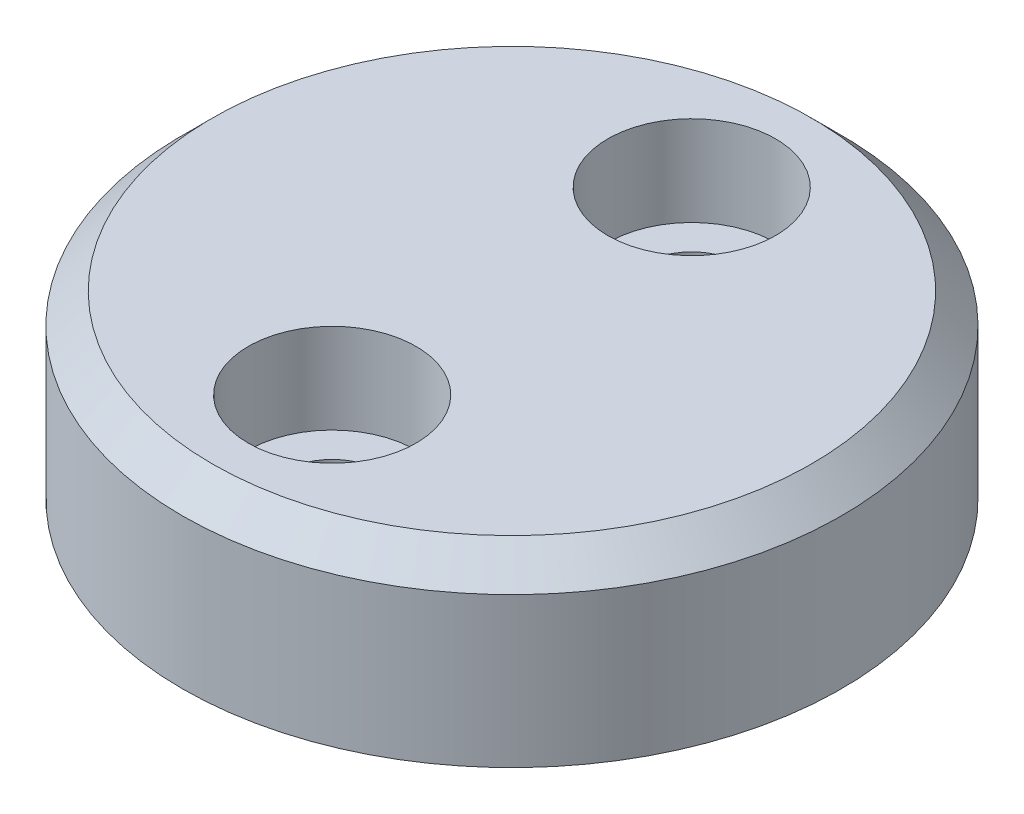
ISO-10303-21;
HEADER;
FILE_DESCRIPTION(('STEP AP214'),'2;1');
FILE_NAME('part.step','',(''),(''),'','','');
FILE_SCHEMA(('AUTOMOTIVE_DESIGN { 1 0 10303 214 1 1 1 1 }'));
ENDSEC;
DATA;
#1=APPLICATION_CONTEXT('core data for automotive mechanical design processes');
#2=APPLICATION_PROTOCOL_DEFINITION('international standard','automotive_design',2000,#1);
#3=PRODUCT_CONTEXT('',#1,'mechanical');
#4=PRODUCT('Part','Part','',(#3));
#5=PRODUCT_RELATED_PRODUCT_CATEGORY('part','',(#4));
#6=PRODUCT_DEFINITION_FORMATION('','',#4);
#7=PRODUCT_DEFINITION_CONTEXT('part definition',#1,'design');
#8=PRODUCT_DEFINITION('design','',#6,#7);
#9=PRODUCT_DEFINITION_SHAPE('','',#8);
#10=(LENGTH_UNIT() NAMED_UNIT(*) SI_UNIT(.MILLI.,.METRE.));
#11=(NAMED_UNIT(*) PLANE_ANGLE_UNIT() SI_UNIT($,.RADIAN.));
#12=(NAMED_UNIT(*) SI_UNIT($,.STERADIAN.) SOLID_ANGLE_UNIT());
#13=UNCERTAINTY_MEASURE_WITH_UNIT(LENGTH_MEASURE(1.E-05),#10,'distance_accuracy_value','');
#14=(GEOMETRIC_REPRESENTATION_CONTEXT(3) GLOBAL_UNCERTAINTY_ASSIGNED_CONTEXT((#13)) GLOBAL_UNIT_ASSIGNED_CONTEXT((#10,
#11,#12)) REPRESENTATION_CONTEXT('',''));
#15=CARTESIAN_POINT('',(0.,0.,0.));
#16=DIRECTION('',(0.,0.,1.));
#17=DIRECTION('',(1.,0.,0.));
#18=AXIS2_PLACEMENT_3D('',#15,#16,#17);
#19=CARTESIAN_POINT('',(0.,0.,6.));
#20=DIRECTION('',(0.,1.,0.));
#21=DIRECTION('',(0.,0.,1.));
#22=AXIS2_PLACEMENT_3D('',#19,#20,#21);
#23=CYLINDRICAL_SURFACE('',#22,1.6);
#24=CARTESIAN_POINT('',(0.,0.,6.));
#25=DIRECTION('',(0.,1.,0.));
#26=DIRECTION('',(0.,0.,1.));
#27=AXIS2_PLACEMENT_3D('',#24,#25,#26);
#28=CIRCLE('',#27,1.6);
#29=CARTESIAN_POINT('',(0.,0.,7.6));
#30=VERTEX_POINT('',#29);
#31=EDGE_CURVE('E65',#30,#30,#28,.T.);
#32=ORIENTED_EDGE('',*,*,#31,.F.);
#33=EDGE_LOOP('',(#32));
#34=FACE_BOUND('',#33,.T.);
#35=CARTESIAN_POINT('',(0.,3.5,6.));
#36=DIRECTION('',(0.,1.,0.));
#37=DIRECTION('',(0.,0.,1.));
#38=AXIS2_PLACEMENT_3D('',#35,#36,#37);
#39=CIRCLE('',#38,1.6);
#40=CARTESIAN_POINT('',(0.,3.5,7.6));
#41=VERTEX_POINT('',#40);
#42=EDGE_CURVE('E42',#41,#41,#39,.F.);
#43=ORIENTED_EDGE('',*,*,#42,.F.);
#44=EDGE_LOOP('',(#43));
#45=FACE_BOUND('',#44,.T.);
#46=ADVANCED_FACE('F39',(#34,#45),#23,.F.);
#47=CARTESIAN_POINT('',(0.,0.,-6.));
#48=DIRECTION('',(0.,1.,0.));
#49=DIRECTION('',(0.,0.,1.));
#50=AXIS2_PLACEMENT_3D('',#47,#48,#49);
#51=CYLINDRICAL_SURFACE('',#50,1.6);
#52=CARTESIAN_POINT('',(0.,0.,-6.));
#53=DIRECTION('',(0.,1.,0.));
#54=DIRECTION('',(0.,0.,1.));
#55=AXIS2_PLACEMENT_3D('',#52,#53,#54);
#56=CIRCLE('',#55,1.6);
#57=CARTESIAN_POINT('',(0.,0.,-4.4));
#58=VERTEX_POINT('',#57);
#59=EDGE_CURVE('E80',#58,#58,#56,.T.);
#60=ORIENTED_EDGE('',*,*,#59,.F.);
#61=EDGE_LOOP('',(#60));
#62=FACE_BOUND('',#61,.T.);
#63=CARTESIAN_POINT('',(0.,3.5,-6.));
#64=DIRECTION('',(0.,1.,0.));
#65=DIRECTION('',(0.,0.,1.));
#66=AXIS2_PLACEMENT_3D('',#63,#64,#65);
#67=CIRCLE('',#66,1.6);
#68=CARTESIAN_POINT('',(0.,3.5,-4.4));
#69=VERTEX_POINT('',#68);
#70=EDGE_CURVE('E57',#69,#69,#67,.F.);
#71=ORIENTED_EDGE('',*,*,#70,.F.);
#72=EDGE_LOOP('',(#71));
#73=FACE_BOUND('',#72,.T.);
#74=ADVANCED_FACE('F102',(#62,#73),#51,.F.);
#75=CARTESIAN_POINT('',(0.,0.5,0.));
#76=DIRECTION('',(0.,-1.,0.));
#77=DIRECTION('',(0.,0.,-1.));
#78=AXIS2_PLACEMENT_3D('',#75,#76,#77);
#79=CYLINDRICAL_SURFACE('',#78,10.);
#80=CARTESIAN_POINT('',(0.,0.5,0.));
#81=DIRECTION('',(0.,1.,0.));
#82=DIRECTION('',(0.,0.,1.));
#83=AXIS2_PLACEMENT_3D('',#80,#81,#82);
#84=CIRCLE('',#83,10.);
#85=CARTESIAN_POINT('',(0.,0.5,10.));
#86=VERTEX_POINT('',#85);
#87=EDGE_CURVE('E52',#86,#86,#84,.T.);
#88=ORIENTED_EDGE('',*,*,#87,.F.);
#89=EDGE_LOOP('',(#88));
#90=FACE_BOUND('',#89,.T.);
#91=CARTESIAN_POINT('',(0.,0.,0.));
#92=DIRECTION('',(0.,1.,0.));
#93=DIRECTION('',(0.,0.,1.));
#94=AXIS2_PLACEMENT_3D('',#91,#92,#93);
#95=CIRCLE('',#94,10.);
#96=CARTESIAN_POINT('',(0.,0.,10.));
#97=VERTEX_POINT('',#96);
#98=EDGE_CURVE('E83',#97,#97,#95,.T.);
#99=ORIENTED_EDGE('',*,*,#98,.T.);
#100=EDGE_LOOP('',(#99));
#101=FACE_BOUND('',#100,.T.);
#102=ADVANCED_FACE('F88',(#90,#101),#79,.T.);
#103=CARTESIAN_POINT('',(0.,0.,0.));
#104=DIRECTION('',(0.,1.,0.));
#105=DIRECTION('',(0.,0.,1.));
#106=AXIS2_PLACEMENT_3D('',#103,#104,#105);
#107=PLANE('',#106);
#108=ORIENTED_EDGE('',*,*,#59,.T.);
#109=EDGE_LOOP('',(#108));
#110=FACE_BOUND('',#109,.T.);
#111=ORIENTED_EDGE('',*,*,#31,.T.);
#112=EDGE_LOOP('',(#111));
#113=FACE_BOUND('',#112,.T.);
#114=ORIENTED_EDGE('',*,*,#98,.F.);
#115=EDGE_LOOP('',(#114));
#116=FACE_BOUND('',#115,.T.);
#117=ADVANCED_FACE('F91',(#110,#113,#116),#107,.F.);
#118=CARTESIAN_POINT('',(0.,6.5,0.));
#119=DIRECTION('',(0.,-1.,0.));
#120=DIRECTION('',(0.,0.,-1.));
#121=AXIS2_PLACEMENT_3D('',#118,#119,#120);
#122=CYLINDRICAL_SURFACE('',#121,11.);
#123=CARTESIAN_POINT('',(0.,5.50000000000001,0.));
#124=DIRECTION('',(0.,1.,0.));
#125=DIRECTION('',(0.,0.,1.));
#126=AXIS2_PLACEMENT_3D('',#123,#124,#125);
#127=CIRCLE('',#126,11.);
#128=CARTESIAN_POINT('',(0.,5.50000000000001,11.));
#129=VERTEX_POINT('',#128);
#130=EDGE_CURVE('E10',#129,#129,#127,.F.);
#131=ORIENTED_EDGE('',*,*,#130,.T.);
#132=EDGE_LOOP('',(#131));
#133=FACE_BOUND('',#132,.T.);
#134=CARTESIAN_POINT('',(0.,0.5,0.));
#135=DIRECTION('',(0.,1.,0.));
#136=DIRECTION('',(0.,0.,1.));
#137=AXIS2_PLACEMENT_3D('',#134,#135,#136);
#138=CIRCLE('',#137,11.);
#139=CARTESIAN_POINT('',(0.,0.5,11.));
#140=VERTEX_POINT('',#139);
#141=EDGE_CURVE('E78',#140,#140,#138,.T.);
#142=ORIENTED_EDGE('',*,*,#141,.T.);
#143=EDGE_LOOP('',(#142));
#144=FACE_BOUND('',#143,.T.);
#145=ADVANCED_FACE('F93',(#133,#144),#122,.T.);
#146=CARTESIAN_POINT('',(0.,6.5,0.));
#147=DIRECTION('',(0.,1.,0.));
#148=DIRECTION('',(0.,0.,1.));
#149=AXIS2_PLACEMENT_3D('',#146,#147,#148);
#150=PLANE('',#149);
#151=CARTESIAN_POINT('',(0.,6.5,-6.));
#152=DIRECTION('',(0.,1.,0.));
#153=DIRECTION('',(0.,0.,1.));
#154=AXIS2_PLACEMENT_3D('',#151,#152,#153);
#155=CIRCLE('',#154,2.8);
#156=CARTESIAN_POINT('',(0.,6.5,-3.2));
#157=VERTEX_POINT('',#156);
#158=EDGE_CURVE('E61',#157,#157,#155,.T.);
#159=ORIENTED_EDGE('',*,*,#158,.F.);
#160=EDGE_LOOP('',(#159));
#161=FACE_BOUND('',#160,.T.);
#162=CARTESIAN_POINT('',(0.,6.5,6.));
#163=DIRECTION('',(0.,1.,0.));
#164=DIRECTION('',(0.,0.,1.));
#165=AXIS2_PLACEMENT_3D('',#162,#163,#164);
#166=CIRCLE('',#165,2.8);
#167=CARTESIAN_POINT('',(0.,6.5,8.8));
#168=VERTEX_POINT('',#167);
#169=EDGE_CURVE('E66',#168,#168,#166,.T.);
#170=ORIENTED_EDGE('',*,*,#169,.F.);
#171=EDGE_LOOP('',(#170));
#172=FACE_BOUND('',#171,.T.);
#173=CARTESIAN_POINT('',(0.,6.5,0.));
#174=DIRECTION('',(0.,1.,0.));
#175=DIRECTION('',(0.,0.,1.));
#176=AXIS2_PLACEMENT_3D('',#173,#174,#175);
#177=CIRCLE('',#176,10.);
#178=CARTESIAN_POINT('',(0.,6.5,10.));
#179=VERTEX_POINT('',#178);
#180=EDGE_CURVE('E48',#179,#179,#177,.T.);
#181=ORIENTED_EDGE('',*,*,#180,.T.);
#182=EDGE_LOOP('',(#181));
#183=FACE_BOUND('',#182,.T.);
#184=ADVANCED_FACE('F105',(#161,#172,#183),#150,.T.);
#185=CARTESIAN_POINT('',(0.,0.5,0.));
#186=DIRECTION('',(0.,1.,0.));
#187=DIRECTION('',(0.,0.,1.));
#188=AXIS2_PLACEMENT_3D('',#185,#186,#187);
#189=PLANE('',#188);
#190=ORIENTED_EDGE('',*,*,#87,.T.);
#191=EDGE_LOOP('',(#190));
#192=FACE_BOUND('',#191,.T.);
#193=ORIENTED_EDGE('',*,*,#141,.F.);
#194=EDGE_LOOP('',(#193));
#195=FACE_BOUND('',#194,.T.);
#196=ADVANCED_FACE('F122',(#192,#195),#189,.F.);
#197=CARTESIAN_POINT('',(0.,6.5,0.));
#198=DIRECTION('',(0.,-1.,0.));
#199=DIRECTION('',(0.,0.,-1.));
#200=AXIS2_PLACEMENT_3D('',#197,#198,#199);
#201=CONICAL_SURFACE('',#200,10.,0.785398163397447);
#202=ORIENTED_EDGE('',*,*,#130,.F.);
#203=EDGE_LOOP('',(#202));
#204=FACE_BOUND('',#203,.T.);
#205=ORIENTED_EDGE('',*,*,#180,.F.);
#206=EDGE_LOOP('',(#205));
#207=FACE_BOUND('',#206,.T.);
#208=ADVANCED_FACE('F45',(#204,#207),#201,.T.);
#209=CARTESIAN_POINT('',(0.,3.5,-6.));
#210=DIRECTION('',(0.,1.,0.));
#211=DIRECTION('',(0.,0.,1.));
#212=AXIS2_PLACEMENT_3D('',#209,#210,#211);
#213=PLANE('',#212);
#214=CARTESIAN_POINT('',(0.,3.5,-6.));
#215=DIRECTION('',(0.,1.,0.));
#216=DIRECTION('',(0.,0.,1.));
#217=AXIS2_PLACEMENT_3D('',#214,#215,#216);
#218=CIRCLE('',#217,2.8);
#219=CARTESIAN_POINT('',(0.,3.5,-3.2));
#220=VERTEX_POINT('',#219);
#221=EDGE_CURVE('E59',#220,#220,#218,.T.);
#222=ORIENTED_EDGE('',*,*,#221,.T.);
#223=EDGE_LOOP('',(#222));
#224=FACE_BOUND('',#223,.T.);
#225=ORIENTED_EDGE('',*,*,#70,.T.);
#226=EDGE_LOOP('',(#225));
#227=FACE_BOUND('',#226,.T.);
#228=ADVANCED_FACE('F130',(#224,#227),#213,.T.);
#229=CARTESIAN_POINT('',(0.,3.5,-6.));
#230=DIRECTION('',(0.,1.,0.));
#231=DIRECTION('',(0.,0.,1.));
#232=AXIS2_PLACEMENT_3D('',#229,#230,#231);
#233=CYLINDRICAL_SURFACE('',#232,2.8);
#234=ORIENTED_EDGE('',*,*,#221,.F.);
#235=EDGE_LOOP('',(#234));
#236=FACE_BOUND('',#235,.T.);
#237=ORIENTED_EDGE('',*,*,#158,.T.);
#238=EDGE_LOOP('',(#237));
#239=FACE_BOUND('',#238,.T.);
#240=ADVANCED_FACE('F139',(#236,#239),#233,.F.);
#241=CARTESIAN_POINT('',(0.,3.5,6.));
#242=DIRECTION('',(0.,1.,0.));
#243=DIRECTION('',(0.,0.,1.));
#244=AXIS2_PLACEMENT_3D('',#241,#242,#243);
#245=PLANE('',#244);
#246=CARTESIAN_POINT('',(0.,3.5,6.));
#247=DIRECTION('',(0.,1.,0.));
#248=DIRECTION('',(0.,0.,1.));
#249=AXIS2_PLACEMENT_3D('',#246,#247,#248);
#250=CIRCLE('',#249,2.8);
#251=CARTESIAN_POINT('',(0.,3.5,8.8));
#252=VERTEX_POINT('',#251);
#253=EDGE_CURVE('E73',#252,#252,#250,.T.);
#254=ORIENTED_EDGE('',*,*,#253,.T.);
#255=EDGE_LOOP('',(#254));
#256=FACE_BOUND('',#255,.T.);
#257=ORIENTED_EDGE('',*,*,#42,.T.);
#258=EDGE_LOOP('',(#257));
#259=FACE_BOUND('',#258,.T.);
#260=ADVANCED_FACE('F144',(#256,#259),#245,.T.);
#261=CARTESIAN_POINT('',(0.,3.5,6.));
#262=DIRECTION('',(0.,1.,0.));
#263=DIRECTION('',(0.,0.,1.));
#264=AXIS2_PLACEMENT_3D('',#261,#262,#263);
#265=CYLINDRICAL_SURFACE('',#264,2.8);
#266=ORIENTED_EDGE('',*,*,#253,.F.);
#267=EDGE_LOOP('',(#266));
#268=FACE_BOUND('',#267,.T.);
#269=ORIENTED_EDGE('',*,*,#169,.T.);
#270=EDGE_LOOP('',(#269));
#271=FACE_BOUND('',#270,.T.);
#272=ADVANCED_FACE('F149',(#268,#271),#265,.F.);
#273=CLOSED_SHELL('',(#46,#74,#102,#117,#145,#184,#196,#208,#228,#240,#260,#272));
#274=MANIFOLD_SOLID_BREP('B2',#273);
#275=ADVANCED_BREP_SHAPE_REPRESENTATION('',(#18,#274),#14);
#276=SHAPE_DEFINITION_REPRESENTATION(#9,#275);
ENDSEC;
END-ISO-10303-21;
